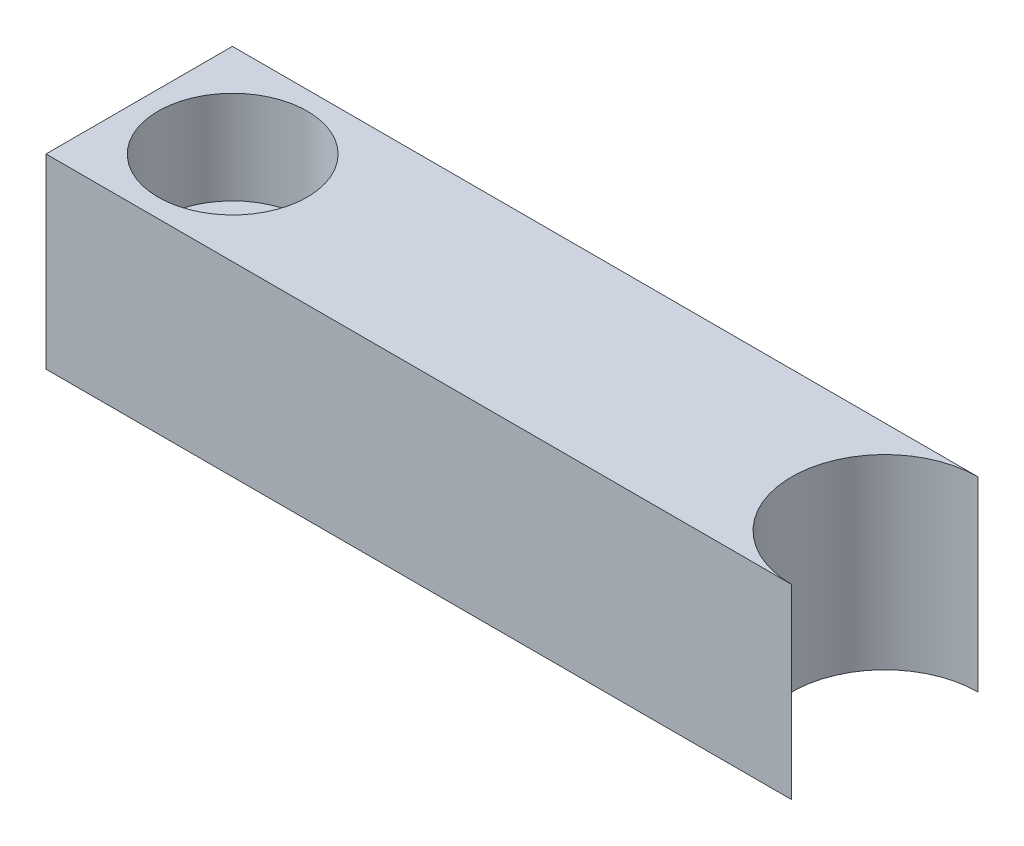
ISO-10303-21;
HEADER;
FILE_DESCRIPTION(('STEP AP214'),'2;1');
FILE_NAME('part.step','',(''),(''),'','','');
FILE_SCHEMA(('AUTOMOTIVE_DESIGN { 1 0 10303 214 1 1 1 1 }'));
ENDSEC;
DATA;
#1=APPLICATION_CONTEXT('core data for automotive mechanical design processes');
#2=APPLICATION_PROTOCOL_DEFINITION('international standard','automotive_design',2000,#1);
#3=PRODUCT_CONTEXT('',#1,'mechanical');
#4=PRODUCT('Part','Part','',(#3));
#5=PRODUCT_RELATED_PRODUCT_CATEGORY('part','',(#4));
#6=PRODUCT_DEFINITION_FORMATION('','',#4);
#7=PRODUCT_DEFINITION_CONTEXT('part definition',#1,'design');
#8=PRODUCT_DEFINITION('design','',#6,#7);
#9=PRODUCT_DEFINITION_SHAPE('','',#8);
#10=(LENGTH_UNIT() NAMED_UNIT(*) SI_UNIT(.MILLI.,.METRE.));
#11=(NAMED_UNIT(*) PLANE_ANGLE_UNIT() SI_UNIT($,.RADIAN.));
#12=(NAMED_UNIT(*) SI_UNIT($,.STERADIAN.) SOLID_ANGLE_UNIT());
#13=UNCERTAINTY_MEASURE_WITH_UNIT(LENGTH_MEASURE(1.E-05),#10,'distance_accuracy_value','');
#14=(GEOMETRIC_REPRESENTATION_CONTEXT(3) GLOBAL_UNCERTAINTY_ASSIGNED_CONTEXT((#13)) GLOBAL_UNIT_ASSIGNED_CONTEXT((#10,
#11,#12)) REPRESENTATION_CONTEXT('',''));
#15=CARTESIAN_POINT('',(0.,0.,0.));
#16=DIRECTION('',(0.,0.,1.));
#17=DIRECTION('',(1.,0.,0.));
#18=AXIS2_PLACEMENT_3D('',#15,#16,#17);
#19=CARTESIAN_POINT('',(0.,3.175,0.));
#20=DIRECTION('',(0.,-1.,0.));
#21=DIRECTION('',(0.,0.,-1.));
#22=AXIS2_PLACEMENT_3D('',#19,#20,#21);
#23=CYLINDRICAL_SURFACE('',#22,1.5875);
#24=CARTESIAN_POINT('',(0.,0.,0.));
#25=DIRECTION('',(0.,1.,0.));
#26=DIRECTION('',(0.,0.,1.));
#27=AXIS2_PLACEMENT_3D('',#24,#25,#26);
#28=CIRCLE('',#27,1.5875);
#29=CARTESIAN_POINT('',(0.,0.,-1.5875));
#30=VERTEX_POINT('',#29);
#31=CARTESIAN_POINT('',(0.,0.,1.5875));
#32=VERTEX_POINT('',#31);
#33=EDGE_CURVE('E91',#30,#32,#28,.T.);
#34=ORIENTED_EDGE('',*,*,#33,.F.);
#35=DIRECTION('',(0.,-1.,0.));
#36=VECTOR('',#35,1.);
#37=CARTESIAN_POINT('',(0.,3.175,-1.5875));
#38=LINE('',#37,#36);
#39=CARTESIAN_POINT('',(0.,3.175,-1.5875));
#40=VERTEX_POINT('',#39);
#41=EDGE_CURVE('E50',#40,#30,#38,.T.);
#42=ORIENTED_EDGE('',*,*,#41,.F.);
#43=CARTESIAN_POINT('',(0.,3.175,0.));
#44=DIRECTION('',(0.,1.,0.));
#45=DIRECTION('',(0.,0.,1.));
#46=AXIS2_PLACEMENT_3D('',#43,#44,#45);
#47=CIRCLE('',#46,1.5875);
#48=CARTESIAN_POINT('',(0.,3.175,1.5875));
#49=VERTEX_POINT('',#48);
#50=EDGE_CURVE('E93',#40,#49,#47,.T.);
#51=ORIENTED_EDGE('',*,*,#50,.T.);
#52=DIRECTION('',(0.,-1.,0.));
#53=VECTOR('',#52,1.);
#54=CARTESIAN_POINT('',(0.,3.175,1.5875));
#55=LINE('',#54,#53);
#56=EDGE_CURVE('E58',#49,#32,#55,.T.);
#57=ORIENTED_EDGE('',*,*,#56,.T.);
#58=EDGE_LOOP('',(#34,#42,#51,#57));
#59=FACE_BOUND('',#58,.T.);
#60=ADVANCED_FACE('F41',(#59),#23,.F.);
#61=CARTESIAN_POINT('',(0.,3.175,-1.5875));
#62=DIRECTION('',(0.,0.,1.));
#63=DIRECTION('',(1.,0.,0.));
#64=AXIS2_PLACEMENT_3D('',#61,#62,#63);
#65=PLANE('',#64);
#66=DIRECTION('',(-1.,0.,0.));
#67=VECTOR('',#66,1.);
#68=CARTESIAN_POINT('',(0.,0.,-1.5875));
#69=LINE('',#68,#67);
#70=CARTESIAN_POINT('',(-12.7,0.,-1.5875));
#71=VERTEX_POINT('',#70);
#72=EDGE_CURVE('E94',#30,#71,#69,.T.);
#73=ORIENTED_EDGE('',*,*,#72,.T.);
#74=DIRECTION('',(0.,-1.,0.));
#75=VECTOR('',#74,1.);
#76=CARTESIAN_POINT('',(-12.7,3.175,-1.5875));
#77=LINE('',#76,#75);
#78=CARTESIAN_POINT('',(-12.7,3.175,-1.5875));
#79=VERTEX_POINT('',#78);
#80=EDGE_CURVE('E102',#79,#71,#77,.T.);
#81=ORIENTED_EDGE('',*,*,#80,.F.);
#82=DIRECTION('',(-1.,0.,0.));
#83=VECTOR('',#82,1.);
#84=CARTESIAN_POINT('',(0.,3.175,-1.5875));
#85=LINE('',#84,#83);
#86=EDGE_CURVE('E119',#40,#79,#85,.T.);
#87=ORIENTED_EDGE('',*,*,#86,.F.);
#88=ORIENTED_EDGE('',*,*,#41,.T.);
#89=EDGE_LOOP('',(#73,#81,#87,#88));
#90=FACE_BOUND('',#89,.T.);
#91=ADVANCED_FACE('F135',(#90),#65,.F.);
#92=CARTESIAN_POINT('',(0.,3.175,1.5875));
#93=DIRECTION('',(0.,0.,1.));
#94=DIRECTION('',(1.,0.,0.));
#95=AXIS2_PLACEMENT_3D('',#92,#93,#94);
#96=PLANE('',#95);
#97=DIRECTION('',(-1.,0.,0.));
#98=VECTOR('',#97,1.);
#99=CARTESIAN_POINT('',(0.,0.,1.5875));
#100=LINE('',#99,#98);
#101=CARTESIAN_POINT('',(-12.7,0.,1.5875));
#102=VERTEX_POINT('',#101);
#103=EDGE_CURVE('E85',#32,#102,#100,.T.);
#104=ORIENTED_EDGE('',*,*,#103,.F.);
#105=ORIENTED_EDGE('',*,*,#56,.F.);
#106=DIRECTION('',(-1.,0.,0.));
#107=VECTOR('',#106,1.);
#108=CARTESIAN_POINT('',(0.,3.175,1.5875));
#109=LINE('',#108,#107);
#110=CARTESIAN_POINT('',(-12.7,3.175,1.5875));
#111=VERTEX_POINT('',#110);
#112=EDGE_CURVE('E74',#49,#111,#109,.T.);
#113=ORIENTED_EDGE('',*,*,#112,.T.);
#114=DIRECTION('',(0.,-1.,0.));
#115=VECTOR('',#114,1.);
#116=CARTESIAN_POINT('',(-12.7,3.175,1.5875));
#117=LINE('',#116,#115);
#118=EDGE_CURVE('E97',#111,#102,#117,.T.);
#119=ORIENTED_EDGE('',*,*,#118,.T.);
#120=EDGE_LOOP('',(#104,#105,#113,#119));
#121=FACE_BOUND('',#120,.T.);
#122=ADVANCED_FACE('F98',(#121),#96,.T.);
#123=CARTESIAN_POINT('',(0.,3.175,0.));
#124=DIRECTION('',(0.,1.,0.));
#125=DIRECTION('',(0.,0.,1.));
#126=AXIS2_PLACEMENT_3D('',#123,#124,#125);
#127=PLANE('',#126);
#128=ORIENTED_EDGE('',*,*,#50,.F.);
#129=ORIENTED_EDGE('',*,*,#86,.T.);
#130=DIRECTION('',(0.,0.,1.));
#131=VECTOR('',#130,1.);
#132=CARTESIAN_POINT('',(-12.7,3.175,0.));
#133=LINE('',#132,#131);
#134=EDGE_CURVE('E103',#79,#111,#133,.T.);
#135=ORIENTED_EDGE('',*,*,#134,.T.);
#136=ORIENTED_EDGE('',*,*,#112,.F.);
#137=EDGE_LOOP('',(#128,#129,#135,#136));
#138=FACE_BOUND('',#137,.T.);
#139=CARTESIAN_POINT('',(-11.1076192527093,3.175,0.));
#140=DIRECTION('',(0.,1.,0.));
#141=DIRECTION('',(0.,0.,1.));
#142=AXIS2_PLACEMENT_3D('',#139,#140,#141);
#143=CIRCLE('',#142,1.27);
#144=CARTESIAN_POINT('',(-11.1076192527093,3.175,1.27));
#145=VERTEX_POINT('',#144);
#146=EDGE_CURVE('E108',#145,#145,#143,.T.);
#147=ORIENTED_EDGE('',*,*,#146,.F.);
#148=EDGE_LOOP('',(#147));
#149=FACE_BOUND('',#148,.T.);
#150=ADVANCED_FACE('F133',(#138,#149),#127,.T.);
#151=CARTESIAN_POINT('',(0.,0.,0.));
#152=DIRECTION('',(0.,1.,0.));
#153=DIRECTION('',(0.,0.,1.));
#154=AXIS2_PLACEMENT_3D('',#151,#152,#153);
#155=PLANE('',#154);
#156=ORIENTED_EDGE('',*,*,#33,.T.);
#157=ORIENTED_EDGE('',*,*,#103,.T.);
#158=DIRECTION('',(0.,0.,1.));
#159=VECTOR('',#158,1.);
#160=CARTESIAN_POINT('',(-12.7,0.,0.));
#161=LINE('',#160,#159);
#162=EDGE_CURVE('E88',#71,#102,#161,.T.);
#163=ORIENTED_EDGE('',*,*,#162,.F.);
#164=ORIENTED_EDGE('',*,*,#72,.F.);
#165=EDGE_LOOP('',(#156,#157,#163,#164));
#166=FACE_BOUND('',#165,.T.);
#167=ADVANCED_FACE('F86',(#166),#155,.F.);
#168=CARTESIAN_POINT('',(-12.7,3.175,0.));
#169=DIRECTION('',(1.,0.,0.));
#170=DIRECTION('',(0.,0.,-1.));
#171=AXIS2_PLACEMENT_3D('',#168,#169,#170);
#172=PLANE('',#171);
#173=ORIENTED_EDGE('',*,*,#162,.T.);
#174=ORIENTED_EDGE('',*,*,#118,.F.);
#175=ORIENTED_EDGE('',*,*,#134,.F.);
#176=ORIENTED_EDGE('',*,*,#80,.T.);
#177=EDGE_LOOP('',(#173,#174,#175,#176));
#178=FACE_BOUND('',#177,.T.);
#179=ADVANCED_FACE('F105',(#178),#172,.F.);
#180=CARTESIAN_POINT('',(-11.1076192527093,3.175,0.));
#181=DIRECTION('',(0.,-1.,0.));
#182=DIRECTION('',(0.,0.,-1.));
#183=AXIS2_PLACEMENT_3D('',#180,#181,#182);
#184=CYLINDRICAL_SURFACE('',#183,1.27);
#185=CARTESIAN_POINT('',(-11.1076192527093,1.5875,0.));
#186=DIRECTION('',(0.,1.,0.));
#187=DIRECTION('',(0.,0.,1.));
#188=AXIS2_PLACEMENT_3D('',#185,#186,#187);
#189=CIRCLE('',#188,1.27);
#190=CARTESIAN_POINT('',(-11.1076192527093,1.5875,1.27));
#191=VERTEX_POINT('',#190);
#192=EDGE_CURVE('E11',#191,#191,#189,.T.);
#193=ORIENTED_EDGE('',*,*,#192,.F.);
#194=EDGE_LOOP('',(#193));
#195=FACE_BOUND('',#194,.T.);
#196=ORIENTED_EDGE('',*,*,#146,.T.);
#197=EDGE_LOOP('',(#196));
#198=FACE_BOUND('',#197,.T.);
#199=ADVANCED_FACE('F150',(#195,#198),#184,.F.);
#200=CARTESIAN_POINT('',(0.,1.5875,0.));
#201=DIRECTION('',(0.,1.,0.));
#202=DIRECTION('',(0.,0.,1.));
#203=AXIS2_PLACEMENT_3D('',#200,#201,#202);
#204=PLANE('',#203);
#205=ORIENTED_EDGE('',*,*,#192,.T.);
#206=EDGE_LOOP('',(#205));
#207=FACE_BOUND('',#206,.T.);
#208=ADVANCED_FACE('F153',(#207),#204,.T.);
#209=CLOSED_SHELL('',(#60,#91,#122,#150,#167,#179,#199,#208));
#210=MANIFOLD_SOLID_BREP('B2',#209);
#211=ADVANCED_BREP_SHAPE_REPRESENTATION('',(#18,#210),#14);
#212=SHAPE_DEFINITION_REPRESENTATION(#9,#211);
ENDSEC;
END-ISO-10303-21;
